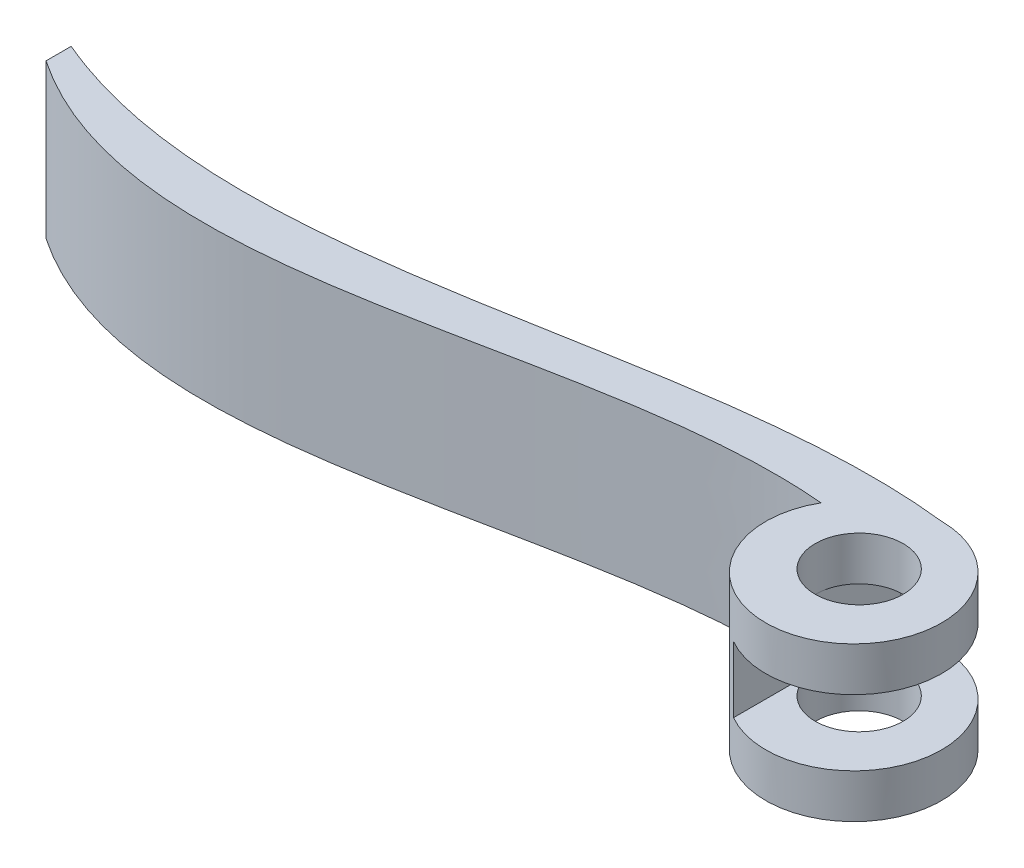
ISO-10303-21;
HEADER;
FILE_DESCRIPTION(('STEP AP214'),'2;1');
FILE_NAME('part.step','',(''),(''),'','','');
FILE_SCHEMA(('AUTOMOTIVE_DESIGN { 1 0 10303 214 1 1 1 1 }'));
ENDSEC;
DATA;
#1=APPLICATION_CONTEXT('core data for automotive mechanical design processes');
#2=APPLICATION_PROTOCOL_DEFINITION('international standard','automotive_design',2000,#1);
#3=PRODUCT_CONTEXT('',#1,'mechanical');
#4=PRODUCT('Part','Part','',(#3));
#5=PRODUCT_RELATED_PRODUCT_CATEGORY('part','',(#4));
#6=PRODUCT_DEFINITION_FORMATION('','',#4);
#7=PRODUCT_DEFINITION_CONTEXT('part definition',#1,'design');
#8=PRODUCT_DEFINITION('design','',#6,#7);
#9=PRODUCT_DEFINITION_SHAPE('','',#8);
#10=(LENGTH_UNIT() NAMED_UNIT(*) SI_UNIT(.MILLI.,.METRE.));
#11=(NAMED_UNIT(*) PLANE_ANGLE_UNIT() SI_UNIT($,.RADIAN.));
#12=(NAMED_UNIT(*) SI_UNIT($,.STERADIAN.) SOLID_ANGLE_UNIT());
#13=UNCERTAINTY_MEASURE_WITH_UNIT(LENGTH_MEASURE(1.E-05),#10,'distance_accuracy_value','');
#14=(GEOMETRIC_REPRESENTATION_CONTEXT(3) GLOBAL_UNCERTAINTY_ASSIGNED_CONTEXT((#13)) GLOBAL_UNIT_ASSIGNED_CONTEXT((#10,
#11,#12)) REPRESENTATION_CONTEXT('',''));
#15=CARTESIAN_POINT('',(0.,0.,0.));
#16=DIRECTION('',(0.,0.,1.));
#17=DIRECTION('',(1.,0.,0.));
#18=AXIS2_PLACEMENT_3D('',#15,#16,#17);
#19=CARTESIAN_POINT('',(0.,14.,-8.));
#20=CARTESIAN_POINT('',(-24.8674638686909,14.,-10.892678597931));
#21=CARTESIAN_POINT('',(-52.7659639032538,14.,4.51003873735478));
#22=CARTESIAN_POINT('',(-76.999999985793,14.,-5.83251416835141));
#23=B_SPLINE_CURVE_WITH_KNOTS('',3,(#19,#20,#21,#22),.UNSPECIFIED.,.F.,.F.,(4,4),(0.,1.),.UNSPECIFIED.);
#24=DIRECTION('',(0.,-1.,0.));
#25=VECTOR('',#24,1.);
#26=SURFACE_OF_LINEAR_EXTRUSION('',#23,#25);
#27=CARTESIAN_POINT('',(0.,4.,-8.));
#28=CARTESIAN_POINT('',(-24.8674638686909,4.,-10.892678597931));
#29=CARTESIAN_POINT('',(-52.7659639032538,4.,4.51003873735478));
#30=CARTESIAN_POINT('',(-76.999999985793,4.,-5.83251416835141));
#31=B_SPLINE_CURVE_WITH_KNOTS('',3,(#27,#28,#29,#30),.UNSPECIFIED.,.F.,.F.,(4,4),(0.,1.),.UNSPECIFIED.);
#32=CARTESIAN_POINT('',(0.,4.,-8.));
#33=VERTEX_POINT('',#32);
#34=CARTESIAN_POINT('',(-4.,4.,-8.31323452822246));
#35=VERTEX_POINT('',#34);
#36=EDGE_CURVE('E134',#33,#35,#31,.T.);
#37=ORIENTED_EDGE('',*,*,#36,.F.);
#38=DIRECTION('',(0.,-1.,0.));
#39=VECTOR('',#38,1.);
#40=CARTESIAN_POINT('',(0.,14.,-8.));
#41=LINE('',#40,#39);
#42=CARTESIAN_POINT('',(0.,0.,-8.));
#43=VERTEX_POINT('',#42);
#44=EDGE_CURVE('E201',#33,#43,#41,.T.);
#45=ORIENTED_EDGE('',*,*,#44,.T.);
#46=CARTESIAN_POINT('',(0.,0.,-8.));
#47=CARTESIAN_POINT('',(-24.8674638686909,0.,-10.892678597931));
#48=CARTESIAN_POINT('',(-52.7659639032538,0.,4.51003873735478));
#49=CARTESIAN_POINT('',(-76.999999985793,0.,-5.83251416835141));
#50=B_SPLINE_CURVE_WITH_KNOTS('',3,(#46,#47,#48,#49),.UNSPECIFIED.,.F.,.F.,(4,4),(0.,1.),.UNSPECIFIED.);
#51=CARTESIAN_POINT('',(-76.999999985793,0.,-5.83251416835141));
#52=VERTEX_POINT('',#51);
#53=EDGE_CURVE('E149',#43,#52,#50,.T.);
#54=ORIENTED_EDGE('',*,*,#53,.T.);
#55=DIRECTION('',(0.,-1.,0.));
#56=VECTOR('',#55,1.);
#57=CARTESIAN_POINT('',(-76.999999985793,14.,-5.83251416835141));
#58=LINE('',#57,#56);
#59=CARTESIAN_POINT('',(-76.999999985793,14.,-5.83251416835141));
#60=VERTEX_POINT('',#59);
#61=EDGE_CURVE('E222',#60,#52,#58,.T.);
#62=ORIENTED_EDGE('',*,*,#61,.F.);
#63=CARTESIAN_POINT('',(0.,14.,-8.));
#64=VERTEX_POINT('',#63);
#65=EDGE_CURVE('E152',#64,#60,#23,.T.);
#66=ORIENTED_EDGE('',*,*,#65,.F.);
#67=CARTESIAN_POINT('',(0.,10.,-8.));
#68=VERTEX_POINT('',#67);
#69=EDGE_CURVE('E208',#64,#68,#41,.T.);
#70=ORIENTED_EDGE('',*,*,#69,.T.);
#71=CARTESIAN_POINT('',(0.,10.,-8.));
#72=CARTESIAN_POINT('',(-24.8674638686909,10.,-10.892678597931));
#73=CARTESIAN_POINT('',(-52.7659639032538,10.,4.51003873735478));
#74=CARTESIAN_POINT('',(-76.999999985793,10.,-5.83251416835141));
#75=B_SPLINE_CURVE_WITH_KNOTS('',3,(#71,#72,#73,#74),.UNSPECIFIED.,.F.,.F.,(4,4),(0.,1.),.UNSPECIFIED.);
#76=CARTESIAN_POINT('',(-4.,10.,-8.31323452822246));
#77=VERTEX_POINT('',#76);
#78=EDGE_CURVE('E61',#77,#68,#75,.F.);
#79=ORIENTED_EDGE('',*,*,#78,.F.);
#80=DIRECTION('',(0.,-1.,0.));
#81=VECTOR('',#80,1.);
#82=CARTESIAN_POINT('',(-4.,14.,-8.31323452822248));
#83=LINE('',#82,#81);
#84=EDGE_CURVE('E133',#35,#77,#83,.F.);
#85=ORIENTED_EDGE('',*,*,#84,.F.);
#86=EDGE_LOOP('',(#37,#45,#54,#62,#66,#70,#79,#85));
#87=FACE_BOUND('',#86,.T.);
#88=ADVANCED_FACE('F45',(#87),#26,.F.);
#89=CARTESIAN_POINT('',(0.,14.,0.));
#90=DIRECTION('',(0.,-1.,0.));
#91=DIRECTION('',(0.,0.,-1.));
#92=AXIS2_PLACEMENT_3D('',#89,#90,#91);
#93=CYLINDRICAL_SURFACE('',#92,8.);
#94=CARTESIAN_POINT('',(0.,4.,0.));
#95=DIRECTION('',(0.,1.,0.));
#96=DIRECTION('',(0.,0.,1.));
#97=AXIS2_PLACEMENT_3D('',#94,#95,#96);
#98=CIRCLE('',#97,8.);
#99=CARTESIAN_POINT('',(-4.,4.,6.92820323027551));
#100=VERTEX_POINT('',#99);
#101=EDGE_CURVE('E131',#100,#33,#98,.T.);
#102=ORIENTED_EDGE('',*,*,#101,.F.);
#103=DIRECTION('',(0.,-1.,0.));
#104=VECTOR('',#103,1.);
#105=CARTESIAN_POINT('',(-4.,14.,6.92820323027551));
#106=LINE('',#105,#104);
#107=CARTESIAN_POINT('',(-4.,10.,6.92820323027551));
#108=VERTEX_POINT('',#107);
#109=EDGE_CURVE('E124',#108,#100,#106,.T.);
#110=ORIENTED_EDGE('',*,*,#109,.F.);
#111=CARTESIAN_POINT('',(0.,10.,0.));
#112=DIRECTION('',(0.,-1.,0.));
#113=DIRECTION('',(0.,0.,-1.));
#114=AXIS2_PLACEMENT_3D('',#111,#112,#113);
#115=CIRCLE('',#114,8.);
#116=EDGE_CURVE('E111',#68,#108,#115,.T.);
#117=ORIENTED_EDGE('',*,*,#116,.F.);
#118=ORIENTED_EDGE('',*,*,#69,.F.);
#119=CARTESIAN_POINT('',(0.,14.,0.));
#120=DIRECTION('',(0.,1.,0.));
#121=DIRECTION('',(0.,0.,1.));
#122=AXIS2_PLACEMENT_3D('',#119,#120,#121);
#123=CIRCLE('',#122,8.);
#124=CARTESIAN_POINT('',(-6.9422959469045,14.,-3.97549078549973));
#125=VERTEX_POINT('',#124);
#126=EDGE_CURVE('E172',#125,#64,#123,.T.);
#127=ORIENTED_EDGE('',*,*,#126,.F.);
#128=DIRECTION('',(0.,-1.,0.));
#129=VECTOR('',#128,1.);
#130=CARTESIAN_POINT('',(-6.9422959469045,14.,-3.97549078549973));
#131=LINE('',#130,#129);
#132=CARTESIAN_POINT('',(-6.9422959469045,0.,-3.97549078549973));
#133=VERTEX_POINT('',#132);
#134=EDGE_CURVE('E212',#125,#133,#131,.T.);
#135=ORIENTED_EDGE('',*,*,#134,.T.);
#136=CARTESIAN_POINT('',(0.,0.,0.));
#137=DIRECTION('',(0.,1.,0.));
#138=DIRECTION('',(0.,0.,1.));
#139=AXIS2_PLACEMENT_3D('',#136,#137,#138);
#140=CIRCLE('',#139,8.);
#141=EDGE_CURVE('E160',#133,#43,#140,.T.);
#142=ORIENTED_EDGE('',*,*,#141,.T.);
#143=ORIENTED_EDGE('',*,*,#44,.F.);
#144=EDGE_LOOP('',(#102,#110,#117,#118,#127,#135,#142,#143));
#145=FACE_BOUND('',#144,.T.);
#146=ADVANCED_FACE('F129',(#145),#93,.T.);
#147=CARTESIAN_POINT('',(0.,14.,-0.5));
#148=DIRECTION('',(0.,-1.,0.));
#149=DIRECTION('',(0.,0.,-1.));
#150=AXIS2_PLACEMENT_3D('',#147,#148,#149);
#151=CYLINDRICAL_SURFACE('',#150,4.);
#152=CARTESIAN_POINT('',(0.,0.,-0.5));
#153=DIRECTION('',(0.,1.,0.));
#154=DIRECTION('',(0.,0.,1.));
#155=AXIS2_PLACEMENT_3D('',#152,#153,#154);
#156=CIRCLE('',#155,4.);
#157=CARTESIAN_POINT('',(0.,0.,3.5));
#158=VERTEX_POINT('',#157);
#159=EDGE_CURVE('E138',#158,#158,#156,.T.);
#160=ORIENTED_EDGE('',*,*,#159,.F.);
#161=EDGE_LOOP('',(#160));
#162=FACE_BOUND('',#161,.T.);
#163=CARTESIAN_POINT('',(0.,4.,-0.5));
#164=DIRECTION('',(0.,1.,0.));
#165=DIRECTION('',(0.,0.,1.));
#166=AXIS2_PLACEMENT_3D('',#163,#164,#165);
#167=CIRCLE('',#166,4.);
#168=CARTESIAN_POINT('',(-4.,4.,-0.5));
#169=VERTEX_POINT('',#168);
#170=EDGE_CURVE('E11',#169,#169,#167,.T.);
#171=ORIENTED_EDGE('',*,*,#170,.T.);
#172=EDGE_LOOP('',(#171));
#173=FACE_BOUND('',#172,.T.);
#174=ADVANCED_FACE('F197',(#162,#173),#151,.F.);
#175=CARTESIAN_POINT('',(0.,14.,-0.5));
#176=DIRECTION('',(0.,1.,0.));
#177=DIRECTION('',(0.,0.,1.));
#178=AXIS2_PLACEMENT_3D('',#175,#176,#177);
#179=CIRCLE('',#178,4.);
#180=CARTESIAN_POINT('',(0.,14.,3.5));
#181=VERTEX_POINT('',#180);
#182=EDGE_CURVE('E145',#181,#181,#179,.T.);
#183=ORIENTED_EDGE('',*,*,#182,.T.);
#184=EDGE_LOOP('',(#183));
#185=FACE_BOUND('',#184,.T.);
#186=CARTESIAN_POINT('',(0.,10.,-0.5));
#187=DIRECTION('',(0.,-1.,0.));
#188=DIRECTION('',(0.,0.,-1.));
#189=AXIS2_PLACEMENT_3D('',#186,#187,#188);
#190=CIRCLE('',#189,4.);
#191=CARTESIAN_POINT('',(-4.,10.,-0.5));
#192=VERTEX_POINT('',#191);
#193=EDGE_CURVE('E54',#192,#192,#190,.T.);
#194=ORIENTED_EDGE('',*,*,#193,.T.);
#195=EDGE_LOOP('',(#194));
#196=FACE_BOUND('',#195,.T.);
#197=ADVANCED_FACE('F228',(#185,#196),#151,.F.);
#198=CARTESIAN_POINT('',(-38.7375354127034,14.,-4.12255421876002));
#199=DIRECTION('',(0.,-1.,0.));
#200=DIRECTION('',(0.,0.,-1.));
#201=AXIS2_PLACEMENT_3D('',#198,#199,#200);
#202=PLANE('',#201);
#203=ORIENTED_EDGE('',*,*,#65,.T.);
#204=DIRECTION('',(0.,0.,1.));
#205=VECTOR('',#204,1.);
#206=CARTESIAN_POINT('',(-76.999999985793,14.,-5.83251416835141));
#207=LINE('',#206,#205);
#208=CARTESIAN_POINT('',(-76.999999985793,14.,-3.54088296389435));
#209=VERTEX_POINT('',#208);
#210=EDGE_CURVE('E159',#60,#209,#207,.T.);
#211=ORIENTED_EDGE('',*,*,#210,.T.);
#212=CARTESIAN_POINT('',(-76.999999985793,14.,-3.54088296389435));
#213=CARTESIAN_POINT('',(-62.0047119920198,14.,6.5665421066295));
#214=CARTESIAN_POINT('',(-37.0641763483116,14.,-1.72189383389706));
#215=CARTESIAN_POINT('',(-13.0889378430374,14.,-4.53703129018424));
#216=CARTESIAN_POINT('',(-6.94229594690451,14.,-3.97549078549973));
#217=B_SPLINE_CURVE_WITH_KNOTS('',3,(#212,#213,#214,#215,#216),.UNSPECIFIED.,.F.,.F.,(4,1,4),
(0.045717222891168,0.745295552538474,1.),.UNSPECIFIED.);
#218=EDGE_CURVE('E166',#209,#125,#217,.T.);
#219=ORIENTED_EDGE('',*,*,#218,.T.);
#220=ORIENTED_EDGE('',*,*,#126,.T.);
#221=EDGE_LOOP('',(#203,#211,#219,#220));
#222=FACE_BOUND('',#221,.T.);
#223=ORIENTED_EDGE('',*,*,#182,.F.);
#224=EDGE_LOOP('',(#223));
#225=FACE_BOUND('',#224,.T.);
#226=ADVANCED_FACE('F190',(#222,#225),#202,.F.);
#227=CARTESIAN_POINT('',(-38.7375354127034,0.,-4.12255421876002));
#228=DIRECTION('',(0.,-1.,0.));
#229=DIRECTION('',(0.,0.,-1.));
#230=AXIS2_PLACEMENT_3D('',#227,#228,#229);
#231=PLANE('',#230);
#232=ORIENTED_EDGE('',*,*,#53,.F.);
#233=ORIENTED_EDGE('',*,*,#141,.F.);
#234=CARTESIAN_POINT('',(-76.999999985793,0.,-3.54088296389435));
#235=CARTESIAN_POINT('',(-62.0047119920198,0.,6.5665421066295));
#236=CARTESIAN_POINT('',(-37.0641763483116,0.,-1.72189383389706));
#237=CARTESIAN_POINT('',(-13.0889378430374,0.,-4.53703129018424));
#238=CARTESIAN_POINT('',(-6.94229594690451,0.,-3.97549078549973));
#239=B_SPLINE_CURVE_WITH_KNOTS('',3,(#234,#235,#236,#237,#238),.UNSPECIFIED.,.F.,.F.,(4,1,4),
(0.045717222891168,0.745295552538474,1.),.UNSPECIFIED.);
#240=CARTESIAN_POINT('',(-76.999999985793,0.,-3.54088296389435));
#241=VERTEX_POINT('',#240);
#242=EDGE_CURVE('E269',#241,#133,#239,.T.);
#243=ORIENTED_EDGE('',*,*,#242,.F.);
#244=DIRECTION('',(0.,0.,1.));
#245=VECTOR('',#244,1.);
#246=CARTESIAN_POINT('',(-76.999999985793,0.,-5.83251416835141));
#247=LINE('',#246,#245);
#248=EDGE_CURVE('E265',#52,#241,#247,.T.);
#249=ORIENTED_EDGE('',*,*,#248,.F.);
#250=EDGE_LOOP('',(#232,#233,#243,#249));
#251=FACE_BOUND('',#250,.T.);
#252=ORIENTED_EDGE('',*,*,#159,.T.);
#253=EDGE_LOOP('',(#252));
#254=FACE_BOUND('',#253,.T.);
#255=ADVANCED_FACE('F185',(#251,#254),#231,.T.);
#256=CARTESIAN_POINT('',(-76.999999985793,14.,-5.83251416835141));
#257=DIRECTION('',(1.,0.,0.));
#258=DIRECTION('',(0.,0.,-1.));
#259=AXIS2_PLACEMENT_3D('',#256,#257,#258);
#260=PLANE('',#259);
#261=ORIENTED_EDGE('',*,*,#248,.T.);
#262=DIRECTION('',(0.,-1.,0.));
#263=VECTOR('',#262,1.);
#264=CARTESIAN_POINT('',(-76.999999985793,14.,-3.54088296389435));
#265=LINE('',#264,#263);
#266=EDGE_CURVE('E218',#209,#241,#265,.T.);
#267=ORIENTED_EDGE('',*,*,#266,.F.);
#268=ORIENTED_EDGE('',*,*,#210,.F.);
#269=ORIENTED_EDGE('',*,*,#61,.T.);
#270=EDGE_LOOP('',(#261,#267,#268,#269));
#271=FACE_BOUND('',#270,.T.);
#272=ADVANCED_FACE('F181',(#271),#260,.F.);
#273=DIRECTION('',(0.,-1.,0.));
#274=VECTOR('',#273,1.);
#275=SURFACE_OF_LINEAR_EXTRUSION('',#217,#274);
#276=ORIENTED_EDGE('',*,*,#242,.T.);
#277=ORIENTED_EDGE('',*,*,#134,.F.);
#278=ORIENTED_EDGE('',*,*,#218,.F.);
#279=ORIENTED_EDGE('',*,*,#266,.T.);
#280=EDGE_LOOP('',(#276,#277,#278,#279));
#281=FACE_BOUND('',#280,.T.);
#282=ADVANCED_FACE('F178',(#281),#275,.F.);
#283=CARTESIAN_POINT('',(-4.,10.,17.));
#284=DIRECTION('',(1.,0.,0.));
#285=DIRECTION('',(0.,1.,0.));
#286=AXIS2_PLACEMENT_3D('',#283,#284,#285);
#287=PLANE('',#286);
#288=ORIENTED_EDGE('',*,*,#84,.T.);
#289=DIRECTION('',(0.,0.,-1.));
#290=VECTOR('',#289,1.);
#291=CARTESIAN_POINT('',(-4.,10.,17.));
#292=LINE('',#291,#290);
#293=EDGE_CURVE('E125',#192,#77,#292,.T.);
#294=ORIENTED_EDGE('',*,*,#293,.F.);
#295=EDGE_CURVE('E115',#108,#192,#292,.T.);
#296=ORIENTED_EDGE('',*,*,#295,.F.);
#297=ORIENTED_EDGE('',*,*,#109,.T.);
#298=DIRECTION('',(0.,0.,-1.));
#299=VECTOR('',#298,1.);
#300=CARTESIAN_POINT('',(-4.,4.,17.));
#301=LINE('',#300,#299);
#302=EDGE_CURVE('E69',#100,#169,#301,.T.);
#303=ORIENTED_EDGE('',*,*,#302,.T.);
#304=EDGE_CURVE('E127',#169,#35,#301,.T.);
#305=ORIENTED_EDGE('',*,*,#304,.T.);
#306=EDGE_LOOP('',(#288,#294,#296,#297,#303,#305));
#307=FACE_BOUND('',#306,.T.);
#308=ADVANCED_FACE('F123',(#307),#287,.T.);
#309=CARTESIAN_POINT('',(-4.,4.,17.));
#310=DIRECTION('',(0.,1.,0.));
#311=DIRECTION('',(0.,0.,1.));
#312=AXIS2_PLACEMENT_3D('',#309,#310,#311);
#313=PLANE('',#312);
#314=ORIENTED_EDGE('',*,*,#36,.T.);
#315=ORIENTED_EDGE('',*,*,#304,.F.);
#316=ORIENTED_EDGE('',*,*,#170,.F.);
#317=ORIENTED_EDGE('',*,*,#302,.F.);
#318=ORIENTED_EDGE('',*,*,#101,.T.);
#319=EDGE_LOOP('',(#314,#315,#316,#317,#318));
#320=FACE_BOUND('',#319,.T.);
#321=ADVANCED_FACE('F243',(#320),#313,.T.);
#322=CARTESIAN_POINT('',(-4.,10.,17.));
#323=DIRECTION('',(0.,-1.,0.));
#324=DIRECTION('',(0.,0.,-1.));
#325=AXIS2_PLACEMENT_3D('',#322,#323,#324);
#326=PLANE('',#325);
#327=ORIENTED_EDGE('',*,*,#78,.T.);
#328=ORIENTED_EDGE('',*,*,#116,.T.);
#329=ORIENTED_EDGE('',*,*,#295,.T.);
#330=ORIENTED_EDGE('',*,*,#193,.F.);
#331=ORIENTED_EDGE('',*,*,#293,.T.);
#332=EDGE_LOOP('',(#327,#328,#329,#330,#331));
#333=FACE_BOUND('',#332,.T.);
#334=ADVANCED_FACE('F113',(#333),#326,.T.);
#335=CLOSED_SHELL('',(#88,#146,#174,#197,#226,#255,#272,#282,#308,#321,#334));
#336=MANIFOLD_SOLID_BREP('B2',#335);
#337=ADVANCED_BREP_SHAPE_REPRESENTATION('',(#18,#336),#14);
#338=SHAPE_DEFINITION_REPRESENTATION(#9,#337);
ENDSEC;
END-ISO-10303-21;
